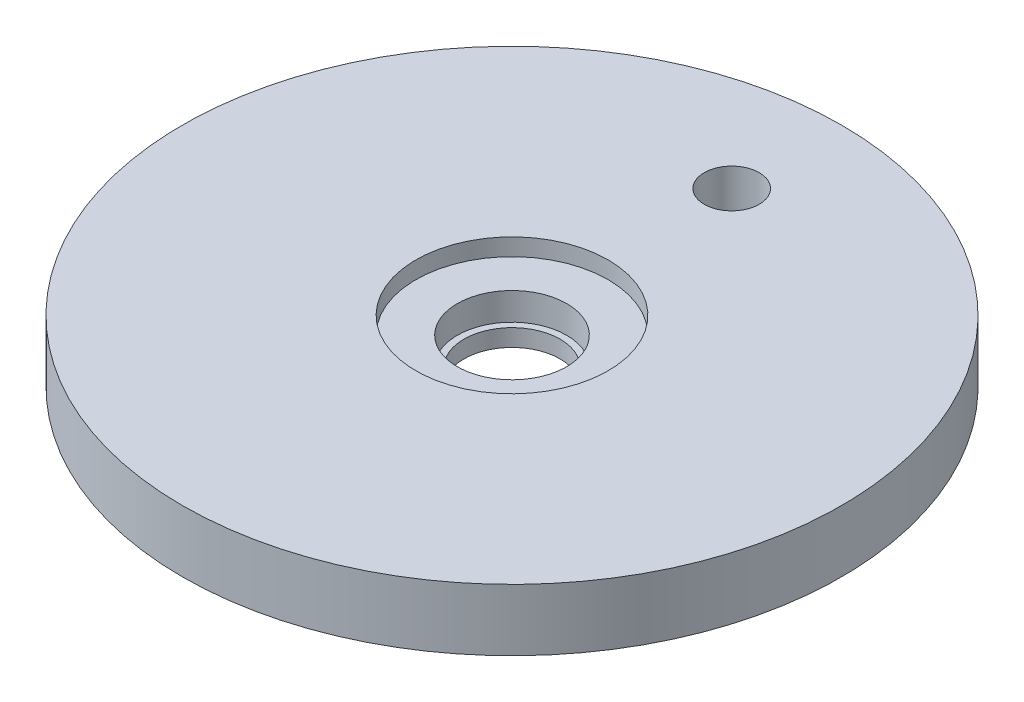
ISO-10303-21;
HEADER;
FILE_DESCRIPTION(('STEP AP214'),'2;1');
FILE_NAME('part.step','',(''),(''),'','','');
FILE_SCHEMA(('AUTOMOTIVE_DESIGN { 1 0 10303 214 1 1 1 1 }'));
ENDSEC;
DATA;
#1=APPLICATION_CONTEXT('core data for automotive mechanical design processes');
#2=APPLICATION_PROTOCOL_DEFINITION('international standard','automotive_design',2000,#1);
#3=PRODUCT_CONTEXT('',#1,'mechanical');
#4=PRODUCT('Part','Part','',(#3));
#5=PRODUCT_RELATED_PRODUCT_CATEGORY('part','',(#4));
#6=PRODUCT_DEFINITION_FORMATION('','',#4);
#7=PRODUCT_DEFINITION_CONTEXT('part definition',#1,'design');
#8=PRODUCT_DEFINITION('design','',#6,#7);
#9=PRODUCT_DEFINITION_SHAPE('','',#8);
#10=(LENGTH_UNIT() NAMED_UNIT(*) SI_UNIT(.MILLI.,.METRE.));
#11=(NAMED_UNIT(*) PLANE_ANGLE_UNIT() SI_UNIT($,.RADIAN.));
#12=(NAMED_UNIT(*) SI_UNIT($,.STERADIAN.) SOLID_ANGLE_UNIT());
#13=UNCERTAINTY_MEASURE_WITH_UNIT(LENGTH_MEASURE(1.E-05),#10,'distance_accuracy_value','');
#14=(GEOMETRIC_REPRESENTATION_CONTEXT(3) GLOBAL_UNCERTAINTY_ASSIGNED_CONTEXT((#13)) GLOBAL_UNIT_ASSIGNED_CONTEXT((#10,
#11,#12)) REPRESENTATION_CONTEXT('',''));
#15=CARTESIAN_POINT('',(0.,0.,0.));
#16=DIRECTION('',(0.,0.,1.));
#17=DIRECTION('',(1.,0.,0.));
#18=AXIS2_PLACEMENT_3D('',#15,#16,#17);
#19=CARTESIAN_POINT('',(7.9375,-2.16266955241735,0.));
#20=DIRECTION('',(0.,-1.,0.));
#21=DIRECTION('',(0.,0.,-1.));
#22=AXIS2_PLACEMENT_3D('',#19,#20,#21);
#23=PLANE('',#22);
#24=CARTESIAN_POINT('',(0.,-2.16266955241735,0.));
#25=DIRECTION('',(0.,-1.,0.));
#26=DIRECTION('',(0.,0.,-1.));
#27=AXIS2_PLACEMENT_3D('',#24,#25,#26);
#28=CIRCLE('',#27,11.1125);
#29=CARTESIAN_POINT('',(0.,-2.16266955241735,-11.1125));
#30=VERTEX_POINT('',#29);
#31=EDGE_CURVE('E94',#30,#30,#28,.T.);
#32=ORIENTED_EDGE('',*,*,#31,.T.);
#33=EDGE_LOOP('',(#32));
#34=FACE_BOUND('',#33,.T.);
#35=CARTESIAN_POINT('',(0.,-2.16266955241735,0.));
#36=DIRECTION('',(0.,-1.,0.));
#37=DIRECTION('',(0.,0.,-1.));
#38=AXIS2_PLACEMENT_3D('',#35,#36,#37);
#39=CIRCLE('',#38,7.9375);
#40=CARTESIAN_POINT('',(0.,-2.16266955241735,-7.9375));
#41=VERTEX_POINT('',#40);
#42=EDGE_CURVE('E10',#41,#41,#39,.T.);
#43=ORIENTED_EDGE('',*,*,#42,.F.);
#44=EDGE_LOOP('',(#43));
#45=FACE_BOUND('',#44,.T.);
#46=ADVANCED_FACE('F43',(#34,#45),#23,.T.);
#47=CARTESIAN_POINT('',(0.,0.,0.));
#48=DIRECTION('',(0.,-1.,0.));
#49=DIRECTION('',(0.,0.,-1.));
#50=AXIS2_PLACEMENT_3D('',#47,#48,#49);
#51=CYLINDRICAL_SURFACE('',#50,7.9375);
#52=ORIENTED_EDGE('',*,*,#42,.T.);
#53=EDGE_LOOP('',(#52));
#54=FACE_BOUND('',#53,.T.);
#55=CARTESIAN_POINT('',(0.,-3.571875,0.));
#56=DIRECTION('',(0.,-1.,0.));
#57=DIRECTION('',(0.,0.,-1.));
#58=AXIS2_PLACEMENT_3D('',#55,#56,#57);
#59=CIRCLE('',#58,7.9375);
#60=CARTESIAN_POINT('',(0.,-3.571875,-7.9375));
#61=VERTEX_POINT('',#60);
#62=EDGE_CURVE('E50',#61,#61,#59,.T.);
#63=ORIENTED_EDGE('',*,*,#62,.F.);
#64=EDGE_LOOP('',(#63));
#65=FACE_BOUND('',#64,.T.);
#66=ADVANCED_FACE('F139',(#54,#65),#51,.T.);
#67=CARTESIAN_POINT('',(5.55625,-3.571875,0.));
#68=DIRECTION('',(0.,-1.,0.));
#69=DIRECTION('',(0.,0.,-1.));
#70=AXIS2_PLACEMENT_3D('',#67,#68,#69);
#71=PLANE('',#70);
#72=ORIENTED_EDGE('',*,*,#62,.T.);
#73=EDGE_LOOP('',(#72));
#74=FACE_BOUND('',#73,.T.);
#75=CARTESIAN_POINT('',(0.,-3.571875,0.));
#76=DIRECTION('',(0.,-1.,0.));
#77=DIRECTION('',(0.,0.,-1.));
#78=AXIS2_PLACEMENT_3D('',#75,#76,#77);
#79=CIRCLE('',#78,5.55625);
#80=CARTESIAN_POINT('',(0.,-3.571875,-5.55625));
#81=VERTEX_POINT('',#80);
#82=EDGE_CURVE('E55',#81,#81,#79,.T.);
#83=ORIENTED_EDGE('',*,*,#82,.F.);
#84=EDGE_LOOP('',(#83));
#85=FACE_BOUND('',#84,.T.);
#86=ADVANCED_FACE('F144',(#74,#85),#71,.T.);
#87=CARTESIAN_POINT('',(0.,0.,0.));
#88=DIRECTION('',(0.,-1.,0.));
#89=DIRECTION('',(0.,0.,-1.));
#90=AXIS2_PLACEMENT_3D('',#87,#88,#89);
#91=CYLINDRICAL_SURFACE('',#90,5.55625);
#92=ORIENTED_EDGE('',*,*,#82,.T.);
#93=EDGE_LOOP('',(#92));
#94=FACE_BOUND('',#93,.T.);
#95=CARTESIAN_POINT('',(0.,-1.5875,0.));
#96=DIRECTION('',(0.,-1.,0.));
#97=DIRECTION('',(0.,0.,-1.));
#98=AXIS2_PLACEMENT_3D('',#95,#96,#97);
#99=CIRCLE('',#98,5.55625);
#100=CARTESIAN_POINT('',(0.,-1.5875,-5.55625));
#101=VERTEX_POINT('',#100);
#102=EDGE_CURVE('E60',#101,#101,#99,.T.);
#103=ORIENTED_EDGE('',*,*,#102,.F.);
#104=EDGE_LOOP('',(#103));
#105=FACE_BOUND('',#104,.T.);
#106=ADVANCED_FACE('F215',(#94,#105),#91,.F.);
#107=CARTESIAN_POINT('',(6.3246,-1.5875,0.));
#108=DIRECTION('',(0.,1.,0.));
#109=DIRECTION('',(0.,0.,1.));
#110=AXIS2_PLACEMENT_3D('',#107,#108,#109);
#111=PLANE('',#110);
#112=ORIENTED_EDGE('',*,*,#102,.T.);
#113=EDGE_LOOP('',(#112));
#114=FACE_BOUND('',#113,.T.);
#115=CARTESIAN_POINT('',(0.,-1.5875,0.));
#116=DIRECTION('',(0.,-1.,0.));
#117=DIRECTION('',(0.,0.,-1.));
#118=AXIS2_PLACEMENT_3D('',#115,#116,#117);
#119=CIRCLE('',#118,6.3246);
#120=CARTESIAN_POINT('',(0.,-1.5875,-6.3246));
#121=VERTEX_POINT('',#120);
#122=EDGE_CURVE('E66',#121,#121,#119,.T.);
#123=ORIENTED_EDGE('',*,*,#122,.F.);
#124=EDGE_LOOP('',(#123));
#125=FACE_BOUND('',#124,.T.);
#126=ADVANCED_FACE('F205',(#114,#125),#111,.T.);
#127=CARTESIAN_POINT('',(0.,0.,0.));
#128=DIRECTION('',(0.,-1.,0.));
#129=DIRECTION('',(0.,0.,-1.));
#130=AXIS2_PLACEMENT_3D('',#127,#128,#129);
#131=CYLINDRICAL_SURFACE('',#130,6.3246);
#132=ORIENTED_EDGE('',*,*,#122,.T.);
#133=EDGE_LOOP('',(#132));
#134=FACE_BOUND('',#133,.T.);
#135=CARTESIAN_POINT('',(0.,1.5875,0.));
#136=DIRECTION('',(0.,-1.,0.));
#137=DIRECTION('',(0.,0.,-1.));
#138=AXIS2_PLACEMENT_3D('',#135,#136,#137);
#139=CIRCLE('',#138,6.3246);
#140=CARTESIAN_POINT('',(0.,1.5875,-6.3246));
#141=VERTEX_POINT('',#140);
#142=EDGE_CURVE('E70',#141,#141,#139,.T.);
#143=ORIENTED_EDGE('',*,*,#142,.F.);
#144=EDGE_LOOP('',(#143));
#145=FACE_BOUND('',#144,.T.);
#146=ADVANCED_FACE('F135',(#134,#145),#131,.F.);
#147=CARTESIAN_POINT('',(11.1125,1.5875,0.));
#148=DIRECTION('',(0.,1.,0.));
#149=DIRECTION('',(0.,0.,1.));
#150=AXIS2_PLACEMENT_3D('',#147,#148,#149);
#151=PLANE('',#150);
#152=ORIENTED_EDGE('',*,*,#142,.T.);
#153=EDGE_LOOP('',(#152));
#154=FACE_BOUND('',#153,.T.);
#155=CARTESIAN_POINT('',(0.,1.5875,0.));
#156=DIRECTION('',(0.,-1.,0.));
#157=DIRECTION('',(0.,0.,-1.));
#158=AXIS2_PLACEMENT_3D('',#155,#156,#157);
#159=CIRCLE('',#158,11.1125);
#160=CARTESIAN_POINT('',(0.,1.5875,-11.1125));
#161=VERTEX_POINT('',#160);
#162=EDGE_CURVE('E74',#161,#161,#159,.T.);
#163=ORIENTED_EDGE('',*,*,#162,.F.);
#164=EDGE_LOOP('',(#163));
#165=FACE_BOUND('',#164,.T.);
#166=ADVANCED_FACE('F128',(#154,#165),#151,.T.);
#167=CARTESIAN_POINT('',(0.,0.,0.));
#168=DIRECTION('',(0.,-1.,0.));
#169=DIRECTION('',(0.,0.,-1.));
#170=AXIS2_PLACEMENT_3D('',#167,#168,#169);
#171=CYLINDRICAL_SURFACE('',#170,11.1125);
#172=ORIENTED_EDGE('',*,*,#162,.T.);
#173=EDGE_LOOP('',(#172));
#174=FACE_BOUND('',#173,.T.);
#175=CARTESIAN_POINT('',(0.,3.571875,0.));
#176=DIRECTION('',(0.,-1.,0.));
#177=DIRECTION('',(0.,0.,-1.));
#178=AXIS2_PLACEMENT_3D('',#175,#176,#177);
#179=CIRCLE('',#178,11.1125);
#180=CARTESIAN_POINT('',(0.,3.571875,-11.1125));
#181=VERTEX_POINT('',#180);
#182=EDGE_CURVE('E78',#181,#181,#179,.T.);
#183=ORIENTED_EDGE('',*,*,#182,.F.);
#184=EDGE_LOOP('',(#183));
#185=FACE_BOUND('',#184,.T.);
#186=ADVANCED_FACE('F121',(#174,#185),#171,.F.);
#187=CARTESIAN_POINT('',(11.1125,3.571875,0.));
#188=DIRECTION('',(0.,-1.,0.));
#189=DIRECTION('',(0.,0.,-1.));
#190=AXIS2_PLACEMENT_3D('',#187,#188,#189);
#191=PLANE('',#190);
#192=CARTESIAN_POINT('',(0.,3.571875,-25.4));
#193=DIRECTION('',(0.,1.,0.));
#194=DIRECTION('',(0.,0.,1.));
#195=AXIS2_PLACEMENT_3D('',#192,#193,#194);
#196=CIRCLE('',#195,3.175);
#197=CARTESIAN_POINT('',(0.,3.571875,-22.225));
#198=VERTEX_POINT('',#197);
#199=EDGE_CURVE('E99',#198,#198,#196,.T.);
#200=ORIENTED_EDGE('',*,*,#199,.F.);
#201=EDGE_LOOP('',(#200));
#202=FACE_BOUND('',#201,.T.);
#203=CARTESIAN_POINT('',(0.,3.571875,0.));
#204=DIRECTION('',(0.,-1.,0.));
#205=DIRECTION('',(0.,0.,-1.));
#206=AXIS2_PLACEMENT_3D('',#203,#204,#205);
#207=CIRCLE('',#206,38.1);
#208=CARTESIAN_POINT('',(0.,3.571875,-38.1));
#209=VERTEX_POINT('',#208);
#210=EDGE_CURVE('E82',#209,#209,#207,.T.);
#211=ORIENTED_EDGE('',*,*,#210,.F.);
#212=EDGE_LOOP('',(#211));
#213=FACE_BOUND('',#212,.T.);
#214=ORIENTED_EDGE('',*,*,#182,.T.);
#215=EDGE_LOOP('',(#214));
#216=FACE_BOUND('',#215,.T.);
#217=ADVANCED_FACE('F117',(#202,#213,#216),#191,.F.);
#218=CARTESIAN_POINT('',(0.,0.,0.));
#219=DIRECTION('',(0.,-1.,0.));
#220=DIRECTION('',(0.,0.,-1.));
#221=AXIS2_PLACEMENT_3D('',#218,#219,#220);
#222=CYLINDRICAL_SURFACE('',#221,38.1);
#223=CARTESIAN_POINT('',(0.,-3.571875,0.));
#224=DIRECTION('',(0.,-1.,0.));
#225=DIRECTION('',(0.,0.,-1.));
#226=AXIS2_PLACEMENT_3D('',#223,#224,#225);
#227=CIRCLE('',#226,38.1);
#228=CARTESIAN_POINT('',(0.,-3.571875,-38.1));
#229=VERTEX_POINT('',#228);
#230=EDGE_CURVE('E86',#229,#229,#227,.T.);
#231=ORIENTED_EDGE('',*,*,#230,.F.);
#232=EDGE_LOOP('',(#231));
#233=FACE_BOUND('',#232,.T.);
#234=ORIENTED_EDGE('',*,*,#210,.T.);
#235=EDGE_LOOP('',(#234));
#236=FACE_BOUND('',#235,.T.);
#237=ADVANCED_FACE('F120',(#233,#236),#222,.T.);
#238=CARTESIAN_POINT('',(11.1125,-3.571875,0.));
#239=DIRECTION('',(0.,-1.,0.));
#240=DIRECTION('',(0.,0.,-1.));
#241=AXIS2_PLACEMENT_3D('',#238,#239,#240);
#242=PLANE('',#241);
#243=CARTESIAN_POINT('',(0.,-3.571875,-25.4));
#244=DIRECTION('',(0.,1.,0.));
#245=DIRECTION('',(0.,0.,1.));
#246=AXIS2_PLACEMENT_3D('',#243,#244,#245);
#247=CIRCLE('',#246,3.175);
#248=CARTESIAN_POINT('',(0.,-3.571875,-22.225));
#249=VERTEX_POINT('',#248);
#250=EDGE_CURVE('E98',#249,#249,#247,.T.);
#251=ORIENTED_EDGE('',*,*,#250,.T.);
#252=EDGE_LOOP('',(#251));
#253=FACE_BOUND('',#252,.T.);
#254=ORIENTED_EDGE('',*,*,#230,.T.);
#255=EDGE_LOOP('',(#254));
#256=FACE_BOUND('',#255,.T.);
#257=CARTESIAN_POINT('',(0.,-3.571875,0.));
#258=DIRECTION('',(0.,-1.,0.));
#259=DIRECTION('',(0.,0.,-1.));
#260=AXIS2_PLACEMENT_3D('',#257,#258,#259);
#261=CIRCLE('',#260,11.1125);
#262=CARTESIAN_POINT('',(0.,-3.571875,-11.1125));
#263=VERTEX_POINT('',#262);
#264=EDGE_CURVE('E90',#263,#263,#261,.T.);
#265=ORIENTED_EDGE('',*,*,#264,.F.);
#266=EDGE_LOOP('',(#265));
#267=FACE_BOUND('',#266,.T.);
#268=ADVANCED_FACE('F107',(#253,#256,#267),#242,.T.);
#269=CARTESIAN_POINT('',(0.,0.,0.));
#270=DIRECTION('',(0.,-1.,0.));
#271=DIRECTION('',(0.,0.,-1.));
#272=AXIS2_PLACEMENT_3D('',#269,#270,#271);
#273=CYLINDRICAL_SURFACE('',#272,11.1125);
#274=ORIENTED_EDGE('',*,*,#264,.T.);
#275=EDGE_LOOP('',(#274));
#276=FACE_BOUND('',#275,.T.);
#277=ORIENTED_EDGE('',*,*,#31,.F.);
#278=EDGE_LOOP('',(#277));
#279=FACE_BOUND('',#278,.T.);
#280=ADVANCED_FACE('F113',(#276,#279),#273,.F.);
#281=CARTESIAN_POINT('',(0.,-3.571875,-25.4));
#282=DIRECTION('',(0.,1.,0.));
#283=DIRECTION('',(0.,0.,1.));
#284=AXIS2_PLACEMENT_3D('',#281,#282,#283);
#285=CYLINDRICAL_SURFACE('',#284,3.175);
#286=CARTESIAN_POINT('',(0.,-3.571875,-22.225));
#287=CARTESIAN_POINT('',(0.,-3.4974609375,-22.225));
#288=CARTESIAN_POINT('',(0.,-3.423046875,-22.225));
#289=CARTESIAN_POINT('',(0.,-3.27421875,-22.225));
#290=CARTESIAN_POINT('',(0.,-3.1998046875,-22.225));
#291=CARTESIAN_POINT('',(0.,-3.0509765625,-22.225));
#292=CARTESIAN_POINT('',(0.,-2.9765625,-22.225));
#293=CARTESIAN_POINT('',(0.,-2.827734375,-22.225));
#294=CARTESIAN_POINT('',(0.,-2.7533203125,-22.225));
#295=CARTESIAN_POINT('',(0.,-2.6044921875,-22.225));
#296=CARTESIAN_POINT('',(0.,-2.530078125,-22.225));
#297=CARTESIAN_POINT('',(0.,-2.38125,-22.225));
#298=CARTESIAN_POINT('',(0.,-2.3068359375,-22.225));
#299=CARTESIAN_POINT('',(0.,-2.1580078125,-22.225));
#300=CARTESIAN_POINT('',(0.,-2.08359375,-22.225));
#301=CARTESIAN_POINT('',(0.,-1.934765625,-22.225));
#302=CARTESIAN_POINT('',(0.,-1.8603515625,-22.225));
#303=CARTESIAN_POINT('',(0.,-1.7115234375,-22.225));
#304=CARTESIAN_POINT('',(0.,-1.637109375,-22.225));
#305=CARTESIAN_POINT('',(0.,-1.48828125,-22.225));
#306=CARTESIAN_POINT('',(0.,-1.4138671875,-22.225));
#307=CARTESIAN_POINT('',(0.,-1.2650390625,-22.225));
#308=CARTESIAN_POINT('',(0.,-1.190625,-22.225));
#309=CARTESIAN_POINT('',(0.,-1.041796875,-22.225));
#310=CARTESIAN_POINT('',(0.,-0.967382812500001,-22.225));
#311=CARTESIAN_POINT('',(0.,-0.8185546875,-22.225));
#312=CARTESIAN_POINT('',(0.,-0.744140625,-22.225));
#313=CARTESIAN_POINT('',(0.,-0.5953125,-22.225));
#314=CARTESIAN_POINT('',(0.,-0.520898437500001,-22.225));
#315=CARTESIAN_POINT('',(0.,-0.372070312500001,-22.225));
#316=CARTESIAN_POINT('',(0.,-0.297656250000001,-22.225));
#317=CARTESIAN_POINT('',(0.,-0.148828125000001,-22.225));
#318=CARTESIAN_POINT('',(0.,-0.0744140625000005,-22.225));
#319=CARTESIAN_POINT('',(0.,0.0744140624999996,-22.225));
#320=CARTESIAN_POINT('',(0.,0.148828125,-22.225));
#321=CARTESIAN_POINT('',(0.,0.29765625,-22.225));
#322=CARTESIAN_POINT('',(0.,0.3720703125,-22.225));
#323=CARTESIAN_POINT('',(0.,0.520898437499999,-22.225));
#324=CARTESIAN_POINT('',(0.,0.595312499999999,-22.225));
#325=CARTESIAN_POINT('',(0.,0.744140625,-22.225));
#326=CARTESIAN_POINT('',(0.,0.8185546875,-22.225));
#327=CARTESIAN_POINT('',(0.,0.967382812499999,-22.225));
#328=CARTESIAN_POINT('',(0.,1.041796875,-22.225));
#329=CARTESIAN_POINT('',(0.,1.190625,-22.225));
#330=CARTESIAN_POINT('',(0.,1.2650390625,-22.225));
#331=CARTESIAN_POINT('',(0.,1.4138671875,-22.225));
#332=CARTESIAN_POINT('',(0.,1.48828125,-22.225));
#333=CARTESIAN_POINT('',(0.,1.637109375,-22.225));
#334=CARTESIAN_POINT('',(0.,1.7115234375,-22.225));
#335=CARTESIAN_POINT('',(0.,1.8603515625,-22.225));
#336=CARTESIAN_POINT('',(0.,1.934765625,-22.225));
#337=CARTESIAN_POINT('',(0.,2.08359375,-22.225));
#338=CARTESIAN_POINT('',(0.,2.1580078125,-22.225));
#339=CARTESIAN_POINT('',(0.,2.3068359375,-22.225));
#340=CARTESIAN_POINT('',(0.,2.38125,-22.225));
#341=CARTESIAN_POINT('',(0.,2.530078125,-22.225));
#342=CARTESIAN_POINT('',(0.,2.6044921875,-22.225));
#343=CARTESIAN_POINT('',(0.,2.7533203125,-22.225));
#344=CARTESIAN_POINT('',(0.,2.827734375,-22.225));
#345=CARTESIAN_POINT('',(0.,2.9765625,-22.225));
#346=CARTESIAN_POINT('',(0.,3.0509765625,-22.225));
#347=CARTESIAN_POINT('',(0.,3.1998046875,-22.225));
#348=CARTESIAN_POINT('',(0.,3.27421875,-22.225));
#349=CARTESIAN_POINT('',(0.,3.423046875,-22.225));
#350=CARTESIAN_POINT('',(0.,3.4974609375,-22.225));
#351=CARTESIAN_POINT('',(0.,3.571875,-22.225));
#352=B_SPLINE_CURVE_WITH_KNOTS('',3,(#286,#287,#288,#289,#290,#291,#292,#293,#294,#295,#296,
#297,#298,#299,#300,#301,#302,#303,#304,#305,#306,#307,#308,#309,#310,#311,#312,#313,#314,#315,
#316,#317,#318,#319,#320,#321,#322,#323,#324,#325,#326,#327,#328,#329,#330,#331,#332,#333,#334,
#335,#336,#337,#338,#339,#340,#341,#342,#343,#344,#345,#346,#347,#348,#349,#350,#351),
.UNSPECIFIED.,.F.,.F.,(4,2,2,2,2,2,2,2,2,2,2,2,2,2,2,2,2,2,2,2,2,2,2,2,2,2,2,2,2,2,2,2,4),(0.,
0.2232421875,0.446484375,0.6697265625,0.89296875,1.1162109375,1.339453125,1.5626953125,
1.7859375,2.0091796875,2.232421875,2.4556640625,2.67890625,2.9021484375,3.125390625,
3.3486328125,3.571875,3.7951171875,4.018359375,4.2416015625,4.46484375,4.6880859375,4.911328125,
5.1345703125,5.3578125,5.5810546875,5.804296875,6.0275390625,6.25078125,6.4740234375,
6.697265625,6.9205078125,7.14375),.UNSPECIFIED.);
#353=EDGE_CURVE('BSEAM110',#249,#198,#352,.T.);
#354=ORIENTED_EDGE('',*,*,#250,.F.);
#355=ORIENTED_EDGE('',*,*,#199,.T.);
#356=ORIENTED_EDGE('',*,*,#353,.T.);
#357=ORIENTED_EDGE('',*,*,#353,.F.);
#358=EDGE_LOOP('',(#354,#356,#355,#357));
#359=FACE_BOUND('',#358,.T.);
#360=ADVANCED_FACE('F110',(#359),#285,.F.);
#361=CLOSED_SHELL('',(#46,#66,#86,#106,#126,#146,#166,#186,#217,#237,#268,#280,#360));
#362=MANIFOLD_SOLID_BREP('B2',#361);
#363=ADVANCED_BREP_SHAPE_REPRESENTATION('',(#18,#362),#14);
#364=SHAPE_DEFINITION_REPRESENTATION(#9,#363);
ENDSEC;
END-ISO-10303-21;
